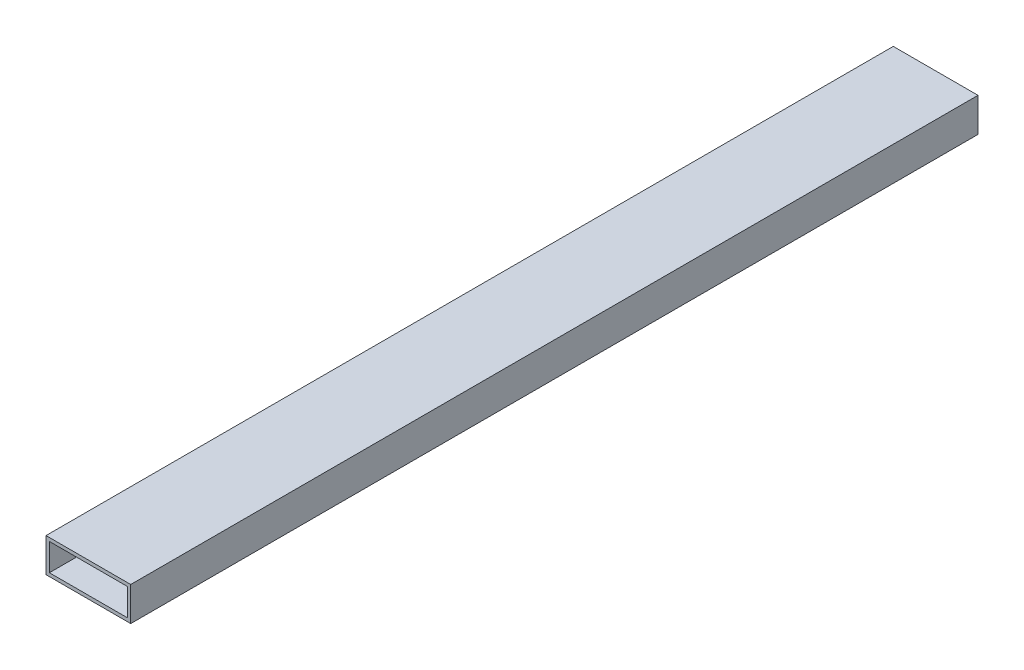
ISO-10303-21;
HEADER;
FILE_DESCRIPTION(('STEP AP214'),'2;1');
FILE_NAME('part.step','',(''),(''),'','','');
FILE_SCHEMA(('AUTOMOTIVE_DESIGN { 1 0 10303 214 1 1 1 1 }'));
ENDSEC;
DATA;
#1=APPLICATION_CONTEXT('core data for automotive mechanical design processes');
#2=APPLICATION_PROTOCOL_DEFINITION('international standard','automotive_design',2000,#1);
#3=PRODUCT_CONTEXT('',#1,'mechanical');
#4=PRODUCT('Part','Part','',(#3));
#5=PRODUCT_RELATED_PRODUCT_CATEGORY('part','',(#4));
#6=PRODUCT_DEFINITION_FORMATION('','',#4);
#7=PRODUCT_DEFINITION_CONTEXT('part definition',#1,'design');
#8=PRODUCT_DEFINITION('design','',#6,#7);
#9=PRODUCT_DEFINITION_SHAPE('','',#8);
#10=(LENGTH_UNIT() NAMED_UNIT(*) SI_UNIT(.MILLI.,.METRE.));
#11=(NAMED_UNIT(*) PLANE_ANGLE_UNIT() SI_UNIT($,.RADIAN.));
#12=(NAMED_UNIT(*) SI_UNIT($,.STERADIAN.) SOLID_ANGLE_UNIT());
#13=UNCERTAINTY_MEASURE_WITH_UNIT(LENGTH_MEASURE(1.E-05),#10,'distance_accuracy_value','');
#14=(GEOMETRIC_REPRESENTATION_CONTEXT(3) GLOBAL_UNCERTAINTY_ASSIGNED_CONTEXT((#13)) GLOBAL_UNIT_ASSIGNED_CONTEXT((#10,
#11,#12)) REPRESENTATION_CONTEXT('',''));
#15=CARTESIAN_POINT('',(0.,0.,0.));
#16=DIRECTION('',(0.,0.,1.));
#17=DIRECTION('',(1.,0.,0.));
#18=AXIS2_PLACEMENT_3D('',#15,#16,#17);
#19=CARTESIAN_POINT('',(0.,0.,500.));
#20=DIRECTION('',(0.,0.,-1.));
#21=DIRECTION('',(-1.,0.,0.));
#22=AXIS2_PLACEMENT_3D('',#19,#20,#21);
#23=PLANE('',#22);
#24=DIRECTION('',(0.,-1.,0.));
#25=VECTOR('',#24,1.);
#26=CARTESIAN_POINT('',(0.,0.,500.));
#27=LINE('',#26,#25);
#28=CARTESIAN_POINT('',(0.,20.,500.));
#29=VERTEX_POINT('',#28);
#30=CARTESIAN_POINT('',(0.,0.,500.));
#31=VERTEX_POINT('',#30);
#32=EDGE_CURVE('E136',#29,#31,#27,.T.);
#33=ORIENTED_EDGE('',*,*,#32,.T.);
#34=DIRECTION('',(1.,0.,0.));
#35=VECTOR('',#34,1.);
#36=CARTESIAN_POINT('',(0.,0.,500.));
#37=LINE('',#36,#35);
#38=CARTESIAN_POINT('',(50.,0.,500.));
#39=VERTEX_POINT('',#38);
#40=EDGE_CURVE('E139',#31,#39,#37,.T.);
#41=ORIENTED_EDGE('',*,*,#40,.T.);
#42=DIRECTION('',(0.,1.,0.));
#43=VECTOR('',#42,1.);
#44=CARTESIAN_POINT('',(50.,0.,500.));
#45=LINE('',#44,#43);
#46=CARTESIAN_POINT('',(50.,20.,500.));
#47=VERTEX_POINT('',#46);
#48=EDGE_CURVE('E142',#39,#47,#45,.T.);
#49=ORIENTED_EDGE('',*,*,#48,.T.);
#50=DIRECTION('',(-1.,0.,0.));
#51=VECTOR('',#50,1.);
#52=CARTESIAN_POINT('',(0.,20.,500.));
#53=LINE('',#52,#51);
#54=EDGE_CURVE('E144',#47,#29,#53,.T.);
#55=ORIENTED_EDGE('',*,*,#54,.T.);
#56=EDGE_LOOP('',(#33,#41,#49,#55));
#57=FACE_BOUND('',#56,.T.);
#58=DIRECTION('',(0.,-1.,0.));
#59=VECTOR('',#58,1.);
#60=CARTESIAN_POINT('',(2.,2.,500.));
#61=LINE('',#60,#59);
#62=CARTESIAN_POINT('',(2.,18.,500.));
#63=VERTEX_POINT('',#62);
#64=CARTESIAN_POINT('',(2.,2.,500.));
#65=VERTEX_POINT('',#64);
#66=EDGE_CURVE('E100',#63,#65,#61,.T.);
#67=ORIENTED_EDGE('',*,*,#66,.F.);
#68=DIRECTION('',(-1.,0.,0.));
#69=VECTOR('',#68,1.);
#70=CARTESIAN_POINT('',(2.,18.,500.));
#71=LINE('',#70,#69);
#72=CARTESIAN_POINT('',(48.,18.,500.));
#73=VERTEX_POINT('',#72);
#74=EDGE_CURVE('E122',#73,#63,#71,.T.);
#75=ORIENTED_EDGE('',*,*,#74,.F.);
#76=DIRECTION('',(0.,1.,0.));
#77=VECTOR('',#76,1.);
#78=CARTESIAN_POINT('',(48.,2.,500.));
#79=LINE('',#78,#77);
#80=CARTESIAN_POINT('',(48.,2.,500.));
#81=VERTEX_POINT('',#80);
#82=EDGE_CURVE('E120',#81,#73,#79,.T.);
#83=ORIENTED_EDGE('',*,*,#82,.F.);
#84=DIRECTION('',(1.,0.,0.));
#85=VECTOR('',#84,1.);
#86=CARTESIAN_POINT('',(2.,2.,500.));
#87=LINE('',#86,#85);
#88=EDGE_CURVE('E108',#65,#81,#87,.T.);
#89=ORIENTED_EDGE('',*,*,#88,.F.);
#90=EDGE_LOOP('',(#67,#75,#83,#89));
#91=FACE_BOUND('',#90,.T.);
#92=ADVANCED_FACE('F35',(#57,#91),#23,.F.);
#93=CARTESIAN_POINT('',(0.,0.,0.));
#94=DIRECTION('',(0.,0.,-1.));
#95=DIRECTION('',(-1.,0.,0.));
#96=AXIS2_PLACEMENT_3D('',#93,#94,#95);
#97=PLANE('',#96);
#98=DIRECTION('',(0.,-1.,0.));
#99=VECTOR('',#98,1.);
#100=CARTESIAN_POINT('',(0.,0.,0.));
#101=LINE('',#100,#99);
#102=CARTESIAN_POINT('',(0.,20.,0.));
#103=VERTEX_POINT('',#102);
#104=CARTESIAN_POINT('',(0.,0.,0.));
#105=VERTEX_POINT('',#104);
#106=EDGE_CURVE('E116',#103,#105,#101,.T.);
#107=ORIENTED_EDGE('',*,*,#106,.F.);
#108=DIRECTION('',(-1.,0.,0.));
#109=VECTOR('',#108,1.);
#110=CARTESIAN_POINT('',(0.,20.,0.));
#111=LINE('',#110,#109);
#112=CARTESIAN_POINT('',(50.,20.,0.));
#113=VERTEX_POINT('',#112);
#114=EDGE_CURVE('E140',#113,#103,#111,.T.);
#115=ORIENTED_EDGE('',*,*,#114,.F.);
#116=DIRECTION('',(0.,1.,0.));
#117=VECTOR('',#116,1.);
#118=CARTESIAN_POINT('',(50.,0.,0.));
#119=LINE('',#118,#117);
#120=CARTESIAN_POINT('',(50.,0.,0.));
#121=VERTEX_POINT('',#120);
#122=EDGE_CURVE('E151',#121,#113,#119,.T.);
#123=ORIENTED_EDGE('',*,*,#122,.F.);
#124=DIRECTION('',(1.,0.,0.));
#125=VECTOR('',#124,1.);
#126=CARTESIAN_POINT('',(0.,0.,0.));
#127=LINE('',#126,#125);
#128=EDGE_CURVE('E149',#105,#121,#127,.T.);
#129=ORIENTED_EDGE('',*,*,#128,.F.);
#130=EDGE_LOOP('',(#107,#115,#123,#129));
#131=FACE_BOUND('',#130,.T.);
#132=DIRECTION('',(-1.,0.,0.));
#133=VECTOR('',#132,1.);
#134=CARTESIAN_POINT('',(2.,18.,0.));
#135=LINE('',#134,#133);
#136=CARTESIAN_POINT('',(48.,18.,0.));
#137=VERTEX_POINT('',#136);
#138=CARTESIAN_POINT('',(2.,18.,0.));
#139=VERTEX_POINT('',#138);
#140=EDGE_CURVE('E109',#137,#139,#135,.T.);
#141=ORIENTED_EDGE('',*,*,#140,.T.);
#142=DIRECTION('',(0.,-1.,0.));
#143=VECTOR('',#142,1.);
#144=CARTESIAN_POINT('',(2.,2.,0.));
#145=LINE('',#144,#143);
#146=CARTESIAN_POINT('',(2.,2.,0.));
#147=VERTEX_POINT('',#146);
#148=EDGE_CURVE('E58',#139,#147,#145,.T.);
#149=ORIENTED_EDGE('',*,*,#148,.T.);
#150=DIRECTION('',(1.,0.,0.));
#151=VECTOR('',#150,1.);
#152=CARTESIAN_POINT('',(2.,2.,0.));
#153=LINE('',#152,#151);
#154=CARTESIAN_POINT('',(48.,2.,0.));
#155=VERTEX_POINT('',#154);
#156=EDGE_CURVE('E115',#147,#155,#153,.T.);
#157=ORIENTED_EDGE('',*,*,#156,.T.);
#158=DIRECTION('',(0.,1.,0.));
#159=VECTOR('',#158,1.);
#160=CARTESIAN_POINT('',(48.,2.,0.));
#161=LINE('',#160,#159);
#162=EDGE_CURVE('E128',#155,#137,#161,.T.);
#163=ORIENTED_EDGE('',*,*,#162,.T.);
#164=EDGE_LOOP('',(#141,#149,#157,#163));
#165=FACE_BOUND('',#164,.T.);
#166=ADVANCED_FACE('F169',(#131,#165),#97,.T.);
#167=CARTESIAN_POINT('',(0.,0.,500.));
#168=DIRECTION('',(1.,0.,0.));
#169=DIRECTION('',(0.,0.,-1.));
#170=AXIS2_PLACEMENT_3D('',#167,#168,#169);
#171=PLANE('',#170);
#172=ORIENTED_EDGE('',*,*,#106,.T.);
#173=DIRECTION('',(0.,0.,-1.));
#174=VECTOR('',#173,1.);
#175=CARTESIAN_POINT('',(0.,0.,500.));
#176=LINE('',#175,#174);
#177=EDGE_CURVE('E11',#31,#105,#176,.T.);
#178=ORIENTED_EDGE('',*,*,#177,.F.);
#179=ORIENTED_EDGE('',*,*,#32,.F.);
#180=DIRECTION('',(0.,0.,-1.));
#181=VECTOR('',#180,1.);
#182=CARTESIAN_POINT('',(0.,20.,500.));
#183=LINE('',#182,#181);
#184=EDGE_CURVE('E146',#29,#103,#183,.T.);
#185=ORIENTED_EDGE('',*,*,#184,.T.);
#186=EDGE_LOOP('',(#172,#178,#179,#185));
#187=FACE_BOUND('',#186,.T.);
#188=ADVANCED_FACE('F37',(#187),#171,.F.);
#189=CARTESIAN_POINT('',(0.,0.,500.));
#190=DIRECTION('',(0.,1.,0.));
#191=DIRECTION('',(0.,0.,1.));
#192=AXIS2_PLACEMENT_3D('',#189,#190,#191);
#193=PLANE('',#192);
#194=ORIENTED_EDGE('',*,*,#128,.T.);
#195=DIRECTION('',(0.,0.,-1.));
#196=VECTOR('',#195,1.);
#197=CARTESIAN_POINT('',(50.,0.,500.));
#198=LINE('',#197,#196);
#199=EDGE_CURVE('E43',#39,#121,#198,.T.);
#200=ORIENTED_EDGE('',*,*,#199,.F.);
#201=ORIENTED_EDGE('',*,*,#40,.F.);
#202=ORIENTED_EDGE('',*,*,#177,.T.);
#203=EDGE_LOOP('',(#194,#200,#201,#202));
#204=FACE_BOUND('',#203,.T.);
#205=ADVANCED_FACE('F179',(#204),#193,.F.);
#206=CARTESIAN_POINT('',(50.,0.,500.));
#207=DIRECTION('',(-1.,0.,0.));
#208=DIRECTION('',(0.,0.,1.));
#209=AXIS2_PLACEMENT_3D('',#206,#207,#208);
#210=PLANE('',#209);
#211=ORIENTED_EDGE('',*,*,#122,.T.);
#212=DIRECTION('',(0.,0.,-1.));
#213=VECTOR('',#212,1.);
#214=CARTESIAN_POINT('',(50.,20.,500.));
#215=LINE('',#214,#213);
#216=EDGE_CURVE('E156',#47,#113,#215,.T.);
#217=ORIENTED_EDGE('',*,*,#216,.F.);
#218=ORIENTED_EDGE('',*,*,#48,.F.);
#219=ORIENTED_EDGE('',*,*,#199,.T.);
#220=EDGE_LOOP('',(#211,#217,#218,#219));
#221=FACE_BOUND('',#220,.T.);
#222=ADVANCED_FACE('F163',(#221),#210,.F.);
#223=CARTESIAN_POINT('',(0.,20.,500.));
#224=DIRECTION('',(0.,-1.,0.));
#225=DIRECTION('',(0.,0.,-1.));
#226=AXIS2_PLACEMENT_3D('',#223,#224,#225);
#227=PLANE('',#226);
#228=ORIENTED_EDGE('',*,*,#114,.T.);
#229=ORIENTED_EDGE('',*,*,#184,.F.);
#230=ORIENTED_EDGE('',*,*,#54,.F.);
#231=ORIENTED_EDGE('',*,*,#216,.T.);
#232=EDGE_LOOP('',(#228,#229,#230,#231));
#233=FACE_BOUND('',#232,.T.);
#234=ADVANCED_FACE('F173',(#233),#227,.F.);
#235=CARTESIAN_POINT('',(2.,2.,500.));
#236=DIRECTION('',(1.,0.,0.));
#237=DIRECTION('',(0.,0.,-1.));
#238=AXIS2_PLACEMENT_3D('',#235,#236,#237);
#239=PLANE('',#238);
#240=ORIENTED_EDGE('',*,*,#148,.F.);
#241=DIRECTION('',(0.,0.,-1.));
#242=VECTOR('',#241,1.);
#243=CARTESIAN_POINT('',(2.,18.,500.));
#244=LINE('',#243,#242);
#245=EDGE_CURVE('E104',#63,#139,#244,.T.);
#246=ORIENTED_EDGE('',*,*,#245,.F.);
#247=ORIENTED_EDGE('',*,*,#66,.T.);
#248=DIRECTION('',(0.,0.,-1.));
#249=VECTOR('',#248,1.);
#250=CARTESIAN_POINT('',(2.,2.,500.));
#251=LINE('',#250,#249);
#252=EDGE_CURVE('E103',#65,#147,#251,.T.);
#253=ORIENTED_EDGE('',*,*,#252,.T.);
#254=EDGE_LOOP('',(#240,#246,#247,#253));
#255=FACE_BOUND('',#254,.T.);
#256=ADVANCED_FACE('F102',(#255),#239,.T.);
#257=CARTESIAN_POINT('',(2.,2.,500.));
#258=DIRECTION('',(0.,1.,0.));
#259=DIRECTION('',(0.,0.,1.));
#260=AXIS2_PLACEMENT_3D('',#257,#258,#259);
#261=PLANE('',#260);
#262=ORIENTED_EDGE('',*,*,#156,.F.);
#263=ORIENTED_EDGE('',*,*,#252,.F.);
#264=ORIENTED_EDGE('',*,*,#88,.T.);
#265=DIRECTION('',(0.,0.,-1.));
#266=VECTOR('',#265,1.);
#267=CARTESIAN_POINT('',(48.,2.,500.));
#268=LINE('',#267,#266);
#269=EDGE_CURVE('E117',#81,#155,#268,.T.);
#270=ORIENTED_EDGE('',*,*,#269,.T.);
#271=EDGE_LOOP('',(#262,#263,#264,#270));
#272=FACE_BOUND('',#271,.T.);
#273=ADVANCED_FACE('F112',(#272),#261,.T.);
#274=CARTESIAN_POINT('',(48.,2.,500.));
#275=DIRECTION('',(-1.,0.,0.));
#276=DIRECTION('',(0.,0.,1.));
#277=AXIS2_PLACEMENT_3D('',#274,#275,#276);
#278=PLANE('',#277);
#279=ORIENTED_EDGE('',*,*,#162,.F.);
#280=ORIENTED_EDGE('',*,*,#269,.F.);
#281=ORIENTED_EDGE('',*,*,#82,.T.);
#282=DIRECTION('',(0.,0.,-1.));
#283=VECTOR('',#282,1.);
#284=CARTESIAN_POINT('',(48.,18.,500.));
#285=LINE('',#284,#283);
#286=EDGE_CURVE('E50',#73,#137,#285,.T.);
#287=ORIENTED_EDGE('',*,*,#286,.T.);
#288=EDGE_LOOP('',(#279,#280,#281,#287));
#289=FACE_BOUND('',#288,.T.);
#290=ADVANCED_FACE('F202',(#289),#278,.T.);
#291=CARTESIAN_POINT('',(2.,18.,500.));
#292=DIRECTION('',(0.,-1.,0.));
#293=DIRECTION('',(0.,0.,-1.));
#294=AXIS2_PLACEMENT_3D('',#291,#292,#293);
#295=PLANE('',#294);
#296=ORIENTED_EDGE('',*,*,#140,.F.);
#297=ORIENTED_EDGE('',*,*,#286,.F.);
#298=ORIENTED_EDGE('',*,*,#74,.T.);
#299=ORIENTED_EDGE('',*,*,#245,.T.);
#300=EDGE_LOOP('',(#296,#297,#298,#299));
#301=FACE_BOUND('',#300,.T.);
#302=ADVANCED_FACE('F206',(#301),#295,.T.);
#303=CLOSED_SHELL('',(#92,#166,#188,#205,#222,#234,#256,#273,#290,#302));
#304=MANIFOLD_SOLID_BREP('B2',#303);
#305=ADVANCED_BREP_SHAPE_REPRESENTATION('',(#18,#304),#14);
#306=SHAPE_DEFINITION_REPRESENTATION(#9,#305);
ENDSEC;
END-ISO-10303-21;
